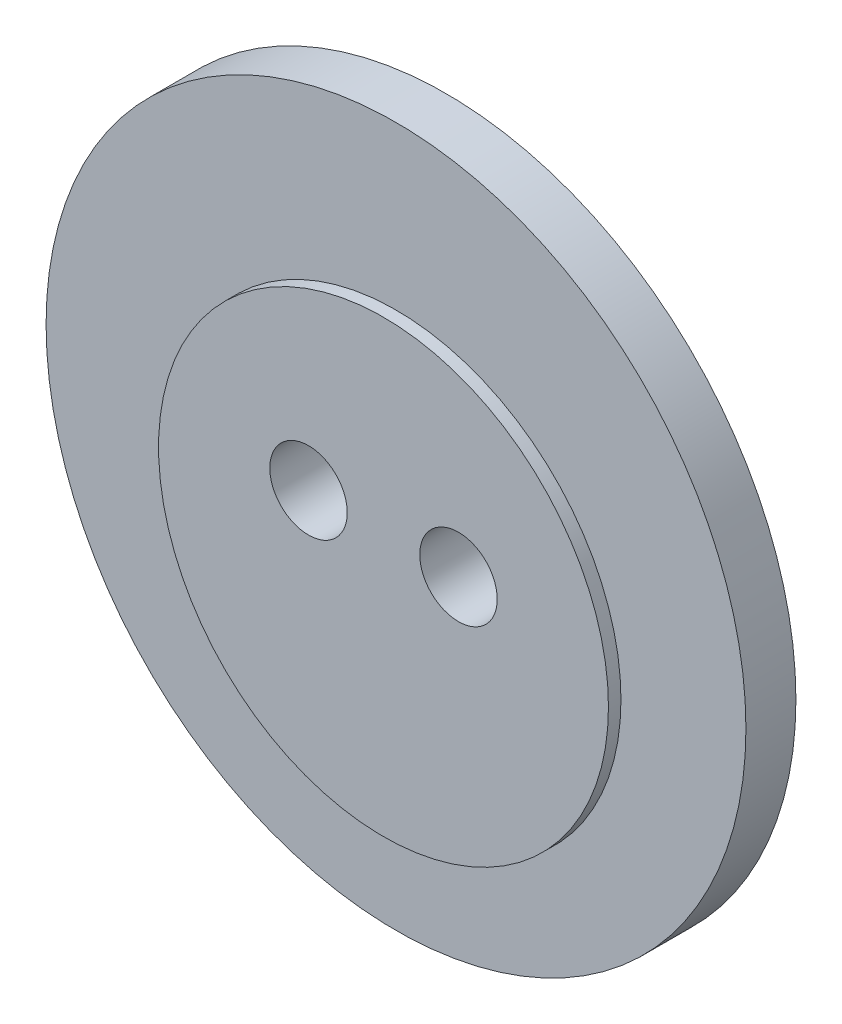
ISO-10303-21;
HEADER;
FILE_DESCRIPTION(('STEP AP214'),'2;1');
FILE_NAME('part.step','',(''),(''),'','','');
FILE_SCHEMA(('AUTOMOTIVE_DESIGN { 1 0 10303 214 1 1 1 1 }'));
ENDSEC;
DATA;
#1=APPLICATION_CONTEXT('core data for automotive mechanical design processes');
#2=APPLICATION_PROTOCOL_DEFINITION('international standard','automotive_design',2000,#1);
#3=PRODUCT_CONTEXT('',#1,'mechanical');
#4=PRODUCT('Part','Part','',(#3));
#5=PRODUCT_RELATED_PRODUCT_CATEGORY('part','',(#4));
#6=PRODUCT_DEFINITION_FORMATION('','',#4);
#7=PRODUCT_DEFINITION_CONTEXT('part definition',#1,'design');
#8=PRODUCT_DEFINITION('design','',#6,#7);
#9=PRODUCT_DEFINITION_SHAPE('','',#8);
#10=(LENGTH_UNIT() NAMED_UNIT(*) SI_UNIT(.MILLI.,.METRE.));
#11=(NAMED_UNIT(*) PLANE_ANGLE_UNIT() SI_UNIT($,.RADIAN.));
#12=(NAMED_UNIT(*) SI_UNIT($,.STERADIAN.) SOLID_ANGLE_UNIT());
#13=UNCERTAINTY_MEASURE_WITH_UNIT(LENGTH_MEASURE(1.E-05),#10,'distance_accuracy_value','');
#14=(GEOMETRIC_REPRESENTATION_CONTEXT(3) GLOBAL_UNCERTAINTY_ASSIGNED_CONTEXT((#13)) GLOBAL_UNIT_ASSIGNED_CONTEXT((#10,
#11,#12)) REPRESENTATION_CONTEXT('',''));
#15=CARTESIAN_POINT('',(0.,0.,0.));
#16=DIRECTION('',(0.,0.,1.));
#17=DIRECTION('',(1.,0.,0.));
#18=AXIS2_PLACEMENT_3D('',#15,#16,#17);
#19=CARTESIAN_POINT('',(0.,0.,2.));
#20=DIRECTION('',(0.,0.,-1.));
#21=DIRECTION('',(-1.,0.,0.));
#22=AXIS2_PLACEMENT_3D('',#19,#20,#21);
#23=CYLINDRICAL_SURFACE('',#22,14.);
#24=CARTESIAN_POINT('',(0.,0.,2.));
#25=DIRECTION('',(0.,0.,1.));
#26=DIRECTION('',(1.,0.,0.));
#27=AXIS2_PLACEMENT_3D('',#24,#25,#26);
#28=CIRCLE('',#27,14.);
#29=CARTESIAN_POINT('',(14.,0.,2.));
#30=VERTEX_POINT('',#29);
#31=EDGE_CURVE('E48',#30,#30,#28,.T.);
#32=ORIENTED_EDGE('',*,*,#31,.F.);
#33=EDGE_LOOP('',(#32));
#34=FACE_BOUND('',#33,.T.);
#35=CARTESIAN_POINT('',(0.,0.,0.));
#36=DIRECTION('',(0.,0.,1.));
#37=DIRECTION('',(1.,0.,0.));
#38=AXIS2_PLACEMENT_3D('',#35,#36,#37);
#39=CIRCLE('',#38,14.);
#40=CARTESIAN_POINT('',(14.,0.,0.));
#41=VERTEX_POINT('',#40);
#42=EDGE_CURVE('E39',#41,#41,#39,.T.);
#43=ORIENTED_EDGE('',*,*,#42,.T.);
#44=EDGE_LOOP('',(#43));
#45=FACE_BOUND('',#44,.T.);
#46=ADVANCED_FACE('F36',(#34,#45),#23,.T.);
#47=CARTESIAN_POINT('',(0.,0.,2.));
#48=DIRECTION('',(0.,0.,1.));
#49=DIRECTION('',(1.,0.,0.));
#50=AXIS2_PLACEMENT_3D('',#47,#48,#49);
#51=PLANE('',#50);
#52=CARTESIAN_POINT('',(0.,-1.5,2.));
#53=DIRECTION('',(0.,0.,1.));
#54=DIRECTION('',(1.,0.,0.));
#55=AXIS2_PLACEMENT_3D('',#52,#53,#54);
#56=CIRCLE('',#55,9.);
#57=CARTESIAN_POINT('',(9.,-1.5,2.));
#58=VERTEX_POINT('',#57);
#59=EDGE_CURVE('E43',#58,#58,#56,.T.);
#60=ORIENTED_EDGE('',*,*,#59,.F.);
#61=EDGE_LOOP('',(#60));
#62=FACE_BOUND('',#61,.T.);
#63=ORIENTED_EDGE('',*,*,#31,.T.);
#64=EDGE_LOOP('',(#63));
#65=FACE_BOUND('',#64,.T.);
#66=ADVANCED_FACE('F66',(#62,#65),#51,.T.);
#67=CARTESIAN_POINT('',(0.,0.,0.));
#68=DIRECTION('',(0.,0.,1.));
#69=DIRECTION('',(1.,0.,0.));
#70=AXIS2_PLACEMENT_3D('',#67,#68,#69);
#71=PLANE('',#70);
#72=CARTESIAN_POINT('',(0.,1.5,0.));
#73=DIRECTION('',(0.,0.,-1.));
#74=DIRECTION('',(-1.,0.,0.));
#75=AXIS2_PLACEMENT_3D('',#72,#73,#74);
#76=CIRCLE('',#75,9.);
#77=CARTESIAN_POINT('',(-9.,1.5,0.));
#78=VERTEX_POINT('',#77);
#79=EDGE_CURVE('E10',#78,#78,#76,.T.);
#80=ORIENTED_EDGE('',*,*,#79,.F.);
#81=EDGE_LOOP('',(#80));
#82=FACE_BOUND('',#81,.T.);
#83=ORIENTED_EDGE('',*,*,#42,.F.);
#84=EDGE_LOOP('',(#83));
#85=FACE_BOUND('',#84,.T.);
#86=ADVANCED_FACE('F63',(#82,#85),#71,.F.);
#87=CARTESIAN_POINT('',(0.,-1.5,2.5));
#88=DIRECTION('',(0.,0.,-1.));
#89=DIRECTION('',(-1.,0.,0.));
#90=AXIS2_PLACEMENT_3D('',#87,#88,#89);
#91=CYLINDRICAL_SURFACE('',#90,9.);
#92=CARTESIAN_POINT('',(0.,-1.5,2.5));
#93=DIRECTION('',(0.,0.,1.));
#94=DIRECTION('',(1.,0.,0.));
#95=AXIS2_PLACEMENT_3D('',#92,#93,#94);
#96=CIRCLE('',#95,9.);
#97=CARTESIAN_POINT('',(9.,-1.5,2.5));
#98=VERTEX_POINT('',#97);
#99=EDGE_CURVE('E54',#98,#98,#96,.T.);
#100=ORIENTED_EDGE('',*,*,#99,.F.);
#101=EDGE_LOOP('',(#100));
#102=FACE_BOUND('',#101,.T.);
#103=ORIENTED_EDGE('',*,*,#59,.T.);
#104=EDGE_LOOP('',(#103));
#105=FACE_BOUND('',#104,.T.);
#106=ADVANCED_FACE('F65',(#102,#105),#91,.T.);
#107=CARTESIAN_POINT('',(0.,-1.5,2.5));
#108=DIRECTION('',(0.,0.,1.));
#109=DIRECTION('',(1.,0.,0.));
#110=AXIS2_PLACEMENT_3D('',#107,#108,#109);
#111=PLANE('',#110);
#112=CARTESIAN_POINT('',(3.,0.,2.5));
#113=DIRECTION('',(0.,0.,1.));
#114=DIRECTION('',(1.,0.,0.));
#115=AXIS2_PLACEMENT_3D('',#112,#113,#114);
#116=CIRCLE('',#115,1.55);
#117=CARTESIAN_POINT('',(4.55,0.,2.5));
#118=VERTEX_POINT('',#117);
#119=EDGE_CURVE('E154',#118,#118,#116,.T.);
#120=ORIENTED_EDGE('',*,*,#119,.F.);
#121=EDGE_LOOP('',(#120));
#122=FACE_BOUND('',#121,.T.);
#123=CARTESIAN_POINT('',(-3.,0.,2.5));
#124=DIRECTION('',(0.,0.,1.));
#125=DIRECTION('',(-1.,0.,0.));
#126=AXIS2_PLACEMENT_3D('',#123,#124,#125);
#127=CIRCLE('',#126,1.55);
#128=CARTESIAN_POINT('',(-4.55,0.,2.5));
#129=VERTEX_POINT('',#128);
#130=EDGE_CURVE('E159',#129,#129,#127,.T.);
#131=ORIENTED_EDGE('',*,*,#130,.F.);
#132=EDGE_LOOP('',(#131));
#133=FACE_BOUND('',#132,.T.);
#134=ORIENTED_EDGE('',*,*,#99,.T.);
#135=EDGE_LOOP('',(#134));
#136=FACE_BOUND('',#135,.T.);
#137=ADVANCED_FACE('F72',(#122,#133,#136),#111,.T.);
#138=CARTESIAN_POINT('',(0.,1.5,-0.5));
#139=DIRECTION('',(0.,0.,1.));
#140=DIRECTION('',(1.,0.,0.));
#141=AXIS2_PLACEMENT_3D('',#138,#139,#140);
#142=CYLINDRICAL_SURFACE('',#141,9.);
#143=CARTESIAN_POINT('',(0.,1.5,-0.5));
#144=DIRECTION('',(0.,0.,-1.));
#145=DIRECTION('',(-1.,0.,0.));
#146=AXIS2_PLACEMENT_3D('',#143,#144,#145);
#147=CIRCLE('',#146,9.);
#148=CARTESIAN_POINT('',(-9.,1.5,-0.5));
#149=VERTEX_POINT('',#148);
#150=EDGE_CURVE('E52',#149,#149,#147,.T.);
#151=ORIENTED_EDGE('',*,*,#150,.F.);
#152=EDGE_LOOP('',(#151));
#153=FACE_BOUND('',#152,.T.);
#154=ORIENTED_EDGE('',*,*,#79,.T.);
#155=EDGE_LOOP('',(#154));
#156=FACE_BOUND('',#155,.T.);
#157=ADVANCED_FACE('F102',(#153,#156),#142,.T.);
#158=CARTESIAN_POINT('',(0.,1.5,-0.5));
#159=DIRECTION('',(0.,0.,-1.));
#160=DIRECTION('',(-1.,0.,0.));
#161=AXIS2_PLACEMENT_3D('',#158,#159,#160);
#162=PLANE('',#161);
#163=CARTESIAN_POINT('',(3.,0.,-0.5));
#164=DIRECTION('',(0.,0.,1.));
#165=DIRECTION('',(1.,0.,0.));
#166=AXIS2_PLACEMENT_3D('',#163,#164,#165);
#167=CIRCLE('',#166,1.55);
#168=CARTESIAN_POINT('',(4.55,0.,-0.5));
#169=VERTEX_POINT('',#168);
#170=EDGE_CURVE('E151',#169,#169,#167,.T.);
#171=ORIENTED_EDGE('',*,*,#170,.T.);
#172=EDGE_LOOP('',(#171));
#173=FACE_BOUND('',#172,.T.);
#174=CARTESIAN_POINT('',(-3.,0.,-0.5));
#175=DIRECTION('',(0.,0.,1.));
#176=DIRECTION('',(-1.,0.,0.));
#177=AXIS2_PLACEMENT_3D('',#174,#175,#176);
#178=CIRCLE('',#177,1.55);
#179=CARTESIAN_POINT('',(-4.55,0.,-0.5));
#180=VERTEX_POINT('',#179);
#181=EDGE_CURVE('E155',#180,#180,#178,.T.);
#182=ORIENTED_EDGE('',*,*,#181,.T.);
#183=EDGE_LOOP('',(#182));
#184=FACE_BOUND('',#183,.T.);
#185=ORIENTED_EDGE('',*,*,#150,.T.);
#186=EDGE_LOOP('',(#185));
#187=FACE_BOUND('',#186,.T.);
#188=ADVANCED_FACE('F107',(#173,#184,#187),#162,.T.);
#189=CARTESIAN_POINT('',(-3.,0.,-0.5));
#190=DIRECTION('',(0.,0.,1.));
#191=DIRECTION('',(1.,0.,0.));
#192=AXIS2_PLACEMENT_3D('',#189,#190,#191);
#193=CYLINDRICAL_SURFACE('',#192,1.55);
#194=ORIENTED_EDGE('',*,*,#181,.F.);
#195=EDGE_LOOP('',(#194));
#196=FACE_BOUND('',#195,.T.);
#197=ORIENTED_EDGE('',*,*,#130,.T.);
#198=EDGE_LOOP('',(#197));
#199=FACE_BOUND('',#198,.T.);
#200=ADVANCED_FACE('F124',(#196,#199),#193,.F.);
#201=CARTESIAN_POINT('',(3.,0.,-0.5));
#202=DIRECTION('',(0.,0.,1.));
#203=DIRECTION('',(1.,0.,0.));
#204=AXIS2_PLACEMENT_3D('',#201,#202,#203);
#205=CYLINDRICAL_SURFACE('',#204,1.55);
#206=ORIENTED_EDGE('',*,*,#170,.F.);
#207=EDGE_LOOP('',(#206));
#208=FACE_BOUND('',#207,.T.);
#209=ORIENTED_EDGE('',*,*,#119,.T.);
#210=EDGE_LOOP('',(#209));
#211=FACE_BOUND('',#210,.T.);
#212=ADVANCED_FACE('F134',(#208,#211),#205,.F.);
#213=CLOSED_SHELL('',(#46,#66,#86,#106,#137,#157,#188,#200,#212));
#214=MANIFOLD_SOLID_BREP('B2',#213);
#215=ADVANCED_BREP_SHAPE_REPRESENTATION('',(#18,#214),#14);
#216=SHAPE_DEFINITION_REPRESENTATION(#9,#215);
ENDSEC;
END-ISO-10303-21;
